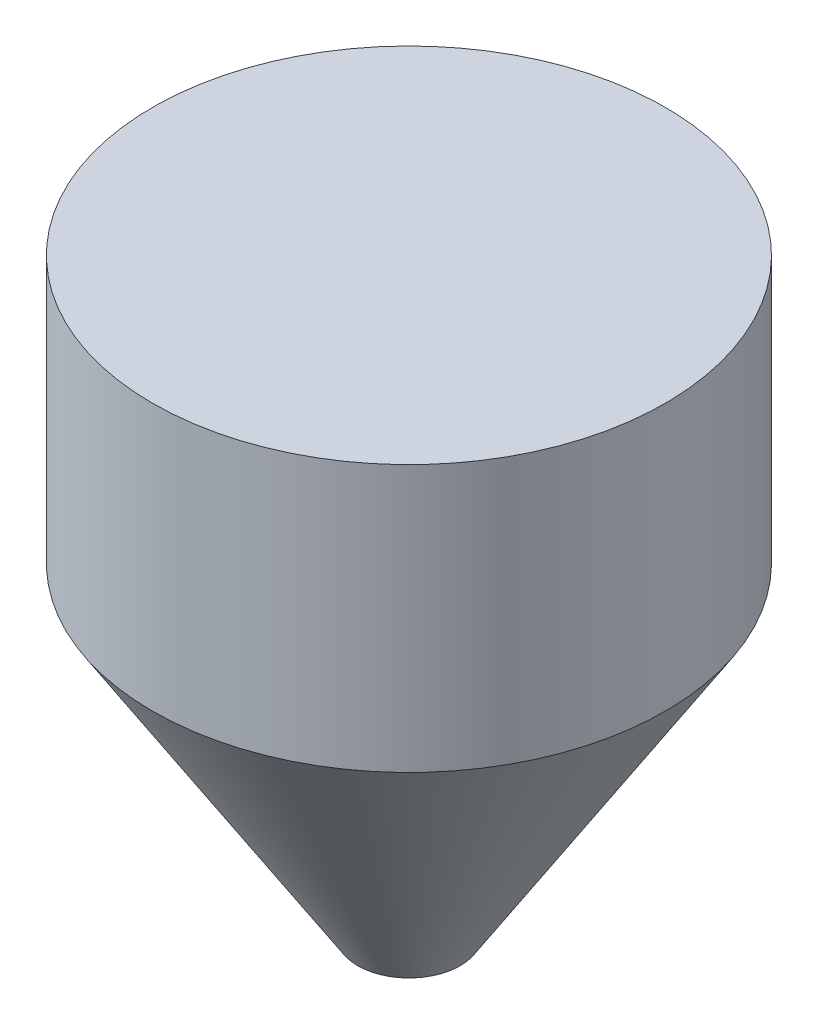
ISO-10303-21;
HEADER;
FILE_DESCRIPTION(('STEP AP214'),'2;1');
FILE_NAME('part.step','',(''),(''),'','','');
FILE_SCHEMA(('AUTOMOTIVE_DESIGN { 1 0 10303 214 1 1 1 1 }'));
ENDSEC;
DATA;
#1=APPLICATION_CONTEXT('core data for automotive mechanical design processes');
#2=APPLICATION_PROTOCOL_DEFINITION('international standard','automotive_design',2000,#1);
#3=PRODUCT_CONTEXT('',#1,'mechanical');
#4=PRODUCT('Part','Part','',(#3));
#5=PRODUCT_RELATED_PRODUCT_CATEGORY('part','',(#4));
#6=PRODUCT_DEFINITION_FORMATION('','',#4);
#7=PRODUCT_DEFINITION_CONTEXT('part definition',#1,'design');
#8=PRODUCT_DEFINITION('design','',#6,#7);
#9=PRODUCT_DEFINITION_SHAPE('','',#8);
#10=(LENGTH_UNIT() NAMED_UNIT(*) SI_UNIT(.MILLI.,.METRE.));
#11=(NAMED_UNIT(*) PLANE_ANGLE_UNIT() SI_UNIT($,.RADIAN.));
#12=(NAMED_UNIT(*) SI_UNIT($,.STERADIAN.) SOLID_ANGLE_UNIT());
#13=UNCERTAINTY_MEASURE_WITH_UNIT(LENGTH_MEASURE(1.E-05),#10,'distance_accuracy_value','');
#14=(GEOMETRIC_REPRESENTATION_CONTEXT(3) GLOBAL_UNCERTAINTY_ASSIGNED_CONTEXT((#13)) GLOBAL_UNIT_ASSIGNED_CONTEXT((#10,
#11,#12)) REPRESENTATION_CONTEXT('',''));
#15=CARTESIAN_POINT('',(0.,0.,0.));
#16=DIRECTION('',(0.,0.,1.));
#17=DIRECTION('',(1.,0.,0.));
#18=AXIS2_PLACEMENT_3D('',#15,#16,#17);
#19=CARTESIAN_POINT('',(0.,-104.,0.));
#20=DIRECTION('',(0.,1.,0.));
#21=DIRECTION('',(0.,0.,1.));
#22=AXIS2_PLACEMENT_3D('',#19,#20,#21);
#23=CYLINDRICAL_SURFACE('',#22,100.);
#24=CARTESIAN_POINT('',(0.,-104.,0.));
#25=DIRECTION('',(0.,-1.,0.));
#26=DIRECTION('',(0.,0.,-1.));
#27=AXIS2_PLACEMENT_3D('',#24,#25,#26);
#28=CIRCLE('',#27,100.);
#29=CARTESIAN_POINT('',(0.,-104.,100.));
#30=VERTEX_POINT('',#29);
#31=EDGE_CURVE('E40',#30,#30,#28,.T.);
#32=CARTESIAN_POINT('',(0.,0.,0.));
#33=DIRECTION('',(0.,1.,0.));
#34=DIRECTION('',(0.,0.,1.));
#35=AXIS2_PLACEMENT_3D('',#32,#33,#34);
#36=CIRCLE('',#35,100.);
#37=CARTESIAN_POINT('',(0.,0.,100.));
#38=VERTEX_POINT('',#37);
#39=EDGE_CURVE('E11',#38,#38,#36,.T.);
#40=CARTESIAN_POINT('',(0.,-104.,100.));
#41=CARTESIAN_POINT('',(0.,-102.916666666667,100.));
#42=CARTESIAN_POINT('',(0.,-101.833333333333,100.));
#43=CARTESIAN_POINT('',(0.,-99.6666666666667,100.));
#44=CARTESIAN_POINT('',(0.,-98.5833333333333,100.));
#45=CARTESIAN_POINT('',(0.,-96.4166666666667,100.));
#46=CARTESIAN_POINT('',(0.,-95.3333333333333,100.));
#47=CARTESIAN_POINT('',(0.,-93.1666666666666,100.));
#48=CARTESIAN_POINT('',(0.,-92.0833333333333,100.));
#49=CARTESIAN_POINT('',(0.,-89.9166666666667,100.));
#50=CARTESIAN_POINT('',(0.,-88.8333333333333,100.));
#51=CARTESIAN_POINT('',(0.,-86.6666666666667,100.));
#52=CARTESIAN_POINT('',(0.,-85.5833333333333,100.));
#53=CARTESIAN_POINT('',(0.,-83.4166666666667,100.));
#54=CARTESIAN_POINT('',(0.,-82.3333333333333,100.));
#55=CARTESIAN_POINT('',(0.,-80.1666666666666,100.));
#56=CARTESIAN_POINT('',(0.,-79.0833333333333,100.));
#57=CARTESIAN_POINT('',(0.,-76.9166666666666,100.));
#58=CARTESIAN_POINT('',(0.,-75.8333333333333,100.));
#59=CARTESIAN_POINT('',(0.,-73.6666666666667,100.));
#60=CARTESIAN_POINT('',(0.,-72.5833333333333,100.));
#61=CARTESIAN_POINT('',(0.,-70.4166666666667,100.));
#62=CARTESIAN_POINT('',(0.,-69.3333333333333,100.));
#63=CARTESIAN_POINT('',(0.,-67.1666666666667,100.));
#64=CARTESIAN_POINT('',(0.,-66.0833333333333,100.));
#65=CARTESIAN_POINT('',(0.,-63.9166666666667,100.));
#66=CARTESIAN_POINT('',(0.,-62.8333333333333,100.));
#67=CARTESIAN_POINT('',(0.,-60.6666666666667,100.));
#68=CARTESIAN_POINT('',(0.,-59.5833333333333,100.));
#69=CARTESIAN_POINT('',(0.,-57.4166666666667,100.));
#70=CARTESIAN_POINT('',(0.,-56.3333333333333,100.));
#71=CARTESIAN_POINT('',(0.,-54.1666666666667,100.));
#72=CARTESIAN_POINT('',(0.,-53.0833333333333,100.));
#73=CARTESIAN_POINT('',(0.,-50.9166666666667,100.));
#74=CARTESIAN_POINT('',(0.,-49.8333333333333,100.));
#75=CARTESIAN_POINT('',(0.,-47.6666666666667,100.));
#76=CARTESIAN_POINT('',(0.,-46.5833333333333,100.));
#77=CARTESIAN_POINT('',(0.,-44.4166666666667,100.));
#78=CARTESIAN_POINT('',(0.,-43.3333333333333,100.));
#79=CARTESIAN_POINT('',(0.,-41.1666666666667,100.));
#80=CARTESIAN_POINT('',(0.,-40.0833333333333,100.));
#81=CARTESIAN_POINT('',(0.,-37.9166666666667,100.));
#82=CARTESIAN_POINT('',(0.,-36.8333333333333,100.));
#83=CARTESIAN_POINT('',(0.,-34.6666666666667,100.));
#84=CARTESIAN_POINT('',(0.,-33.5833333333333,100.));
#85=CARTESIAN_POINT('',(0.,-31.4166666666667,100.));
#86=CARTESIAN_POINT('',(0.,-30.3333333333333,100.));
#87=CARTESIAN_POINT('',(0.,-28.1666666666667,100.));
#88=CARTESIAN_POINT('',(0.,-27.0833333333333,100.));
#89=CARTESIAN_POINT('',(0.,-24.9166666666667,100.));
#90=CARTESIAN_POINT('',(0.,-23.8333333333333,100.));
#91=CARTESIAN_POINT('',(0.,-21.6666666666667,100.));
#92=CARTESIAN_POINT('',(0.,-20.5833333333333,100.));
#93=CARTESIAN_POINT('',(0.,-18.4166666666667,100.));
#94=CARTESIAN_POINT('',(0.,-17.3333333333333,100.));
#95=CARTESIAN_POINT('',(0.,-15.1666666666667,100.));
#96=CARTESIAN_POINT('',(0.,-14.0833333333333,100.));
#97=CARTESIAN_POINT('',(0.,-11.9166666666667,100.));
#98=CARTESIAN_POINT('',(0.,-10.8333333333333,100.));
#99=CARTESIAN_POINT('',(0.,-8.66666666666666,100.));
#100=CARTESIAN_POINT('',(0.,-7.58333333333333,100.));
#101=CARTESIAN_POINT('',(0.,-5.41666666666667,100.));
#102=CARTESIAN_POINT('',(0.,-4.33333333333334,100.));
#103=CARTESIAN_POINT('',(0.,-2.16666666666667,100.));
#104=CARTESIAN_POINT('',(0.,-1.08333333333333,100.));
#105=CARTESIAN_POINT('',(0.,0.,100.));
#106=B_SPLINE_CURVE_WITH_KNOTS('',3,(#40,#41,#42,#43,#44,#45,#46,#47,#48,#49,#50,#51,#52,#53,
#54,#55,#56,#57,#58,#59,#60,#61,#62,#63,#64,#65,#66,#67,#68,#69,#70,#71,#72,#73,#74,#75,#76,#77,
#78,#79,#80,#81,#82,#83,#84,#85,#86,#87,#88,#89,#90,#91,#92,#93,#94,#95,#96,#97,#98,#99,#100,
#101,#102,#103,#104,#105),.UNSPECIFIED.,.F.,.F.,(4,2,2,2,2,2,2,2,2,2,2,2,2,2,2,2,2,2,2,2,2,2,2,
2,2,2,2,2,2,2,2,2,4),(0.,3.25,6.50000000000001,9.75000000000001,13.,16.25,19.5,22.75,26.,29.25,
32.5,35.75,39.,42.25,45.5,48.75,52.,55.25,58.5,61.75,65.,68.25,71.5,74.75,78.,81.25,84.5,87.75,
91.,94.25,97.5,100.75,104.),.UNSPECIFIED.);
#107=EDGE_CURVE('BSEAM34',#30,#38,#106,.T.);
#108=ORIENTED_EDGE('',*,*,#31,.F.);
#109=ORIENTED_EDGE('',*,*,#39,.F.);
#110=ORIENTED_EDGE('',*,*,#107,.T.);
#111=ORIENTED_EDGE('',*,*,#107,.F.);
#112=EDGE_LOOP('',(#108,#110,#109,#111));
#113=FACE_BOUND('',#112,.T.);
#114=ADVANCED_FACE('F34',(#113),#23,.T.);
#115=CARTESIAN_POINT('',(0.,0.,0.));
#116=DIRECTION('',(0.,1.,0.));
#117=DIRECTION('',(0.,0.,1.));
#118=AXIS2_PLACEMENT_3D('',#115,#116,#117);
#119=PLANE('',#118);
#120=ORIENTED_EDGE('',*,*,#39,.T.);
#121=EDGE_LOOP('',(#120));
#122=FACE_BOUND('',#121,.T.);
#123=ADVANCED_FACE('F68',(#122),#119,.T.);
#124=CARTESIAN_POINT('',(0.,-230.,0.));
#125=DIRECTION('',(0.,1.,0.));
#126=DIRECTION('',(0.,0.,1.));
#127=AXIS2_PLACEMENT_3D('',#124,#125,#126);
#128=PLANE('',#127);
#129=CARTESIAN_POINT('',(0.,-230.,0.));
#130=DIRECTION('',(0.,1.,0.));
#131=DIRECTION('',(0.,0.,1.));
#132=AXIS2_PLACEMENT_3D('',#129,#130,#131);
#133=CIRCLE('',#132,20.);
#134=CARTESIAN_POINT('',(0.,-230.,20.));
#135=VERTEX_POINT('',#134);
#136=EDGE_CURVE('E44',#135,#135,#133,.T.);
#137=ORIENTED_EDGE('',*,*,#136,.F.);
#138=EDGE_LOOP('',(#137));
#139=FACE_BOUND('',#138,.T.);
#140=ADVANCED_FACE('F58',(#139),#128,.F.);
#141=CARTESIAN_POINT('',(0.,-230.,0.));
#142=DIRECTION('',(0.,1.,0.));
#143=DIRECTION('',(0.,0.,1.));
#144=AXIS2_PLACEMENT_3D('',#141,#142,#143);
#145=CONICAL_SURFACE('',#144,20.,0.565701468656178);
#146=CARTESIAN_POINT('',(0.,-230.,20.));
#147=CARTESIAN_POINT('',(0.,-228.6875,20.8333333333333));
#148=CARTESIAN_POINT('',(0.,-227.375,21.6666666666667));
#149=CARTESIAN_POINT('',(0.,-224.75,23.3333333333333));
#150=CARTESIAN_POINT('',(0.,-223.4375,24.1666666666667));
#151=CARTESIAN_POINT('',(0.,-220.8125,25.8333333333333));
#152=CARTESIAN_POINT('',(0.,-219.5,26.6666666666667));
#153=CARTESIAN_POINT('',(0.,-216.875,28.3333333333333));
#154=CARTESIAN_POINT('',(0.,-215.5625,29.1666666666667));
#155=CARTESIAN_POINT('',(0.,-212.9375,30.8333333333333));
#156=CARTESIAN_POINT('',(0.,-211.625,31.6666666666667));
#157=CARTESIAN_POINT('',(0.,-209.,33.3333333333333));
#158=CARTESIAN_POINT('',(0.,-207.6875,34.1666666666667));
#159=CARTESIAN_POINT('',(0.,-205.0625,35.8333333333333));
#160=CARTESIAN_POINT('',(0.,-203.75,36.6666666666667));
#161=CARTESIAN_POINT('',(0.,-201.125,38.3333333333333));
#162=CARTESIAN_POINT('',(0.,-199.8125,39.1666666666667));
#163=CARTESIAN_POINT('',(0.,-197.1875,40.8333333333333));
#164=CARTESIAN_POINT('',(0.,-195.875,41.6666666666667));
#165=CARTESIAN_POINT('',(0.,-193.25,43.3333333333333));
#166=CARTESIAN_POINT('',(0.,-191.9375,44.1666666666667));
#167=CARTESIAN_POINT('',(0.,-189.3125,45.8333333333333));
#168=CARTESIAN_POINT('',(0.,-188.,46.6666666666667));
#169=CARTESIAN_POINT('',(0.,-185.375,48.3333333333333));
#170=CARTESIAN_POINT('',(0.,-184.0625,49.1666666666667));
#171=CARTESIAN_POINT('',(0.,-181.4375,50.8333333333333));
#172=CARTESIAN_POINT('',(0.,-180.125,51.6666666666667));
#173=CARTESIAN_POINT('',(0.,-177.5,53.3333333333333));
#174=CARTESIAN_POINT('',(0.,-176.1875,54.1666666666667));
#175=CARTESIAN_POINT('',(0.,-173.5625,55.8333333333333));
#176=CARTESIAN_POINT('',(0.,-172.25,56.6666666666667));
#177=CARTESIAN_POINT('',(0.,-169.625,58.3333333333333));
#178=CARTESIAN_POINT('',(0.,-168.3125,59.1666666666667));
#179=CARTESIAN_POINT('',(0.,-165.6875,60.8333333333333));
#180=CARTESIAN_POINT('',(0.,-164.375,61.6666666666667));
#181=CARTESIAN_POINT('',(0.,-161.75,63.3333333333333));
#182=CARTESIAN_POINT('',(0.,-160.4375,64.1666666666667));
#183=CARTESIAN_POINT('',(0.,-157.8125,65.8333333333334));
#184=CARTESIAN_POINT('',(0.,-156.5,66.6666666666667));
#185=CARTESIAN_POINT('',(0.,-153.875,68.3333333333333));
#186=CARTESIAN_POINT('',(0.,-152.5625,69.1666666666667));
#187=CARTESIAN_POINT('',(0.,-149.9375,70.8333333333333));
#188=CARTESIAN_POINT('',(0.,-148.625,71.6666666666667));
#189=CARTESIAN_POINT('',(0.,-146.,73.3333333333333));
#190=CARTESIAN_POINT('',(0.,-144.6875,74.1666666666667));
#191=CARTESIAN_POINT('',(0.,-142.0625,75.8333333333333));
#192=CARTESIAN_POINT('',(0.,-140.75,76.6666666666667));
#193=CARTESIAN_POINT('',(0.,-138.125,78.3333333333334));
#194=CARTESIAN_POINT('',(0.,-136.8125,79.1666666666667));
#195=CARTESIAN_POINT('',(0.,-134.1875,80.8333333333334));
#196=CARTESIAN_POINT('',(0.,-132.875,81.6666666666667));
#197=CARTESIAN_POINT('',(0.,-130.25,83.3333333333334));
#198=CARTESIAN_POINT('',(0.,-128.9375,84.1666666666667));
#199=CARTESIAN_POINT('',(0.,-126.3125,85.8333333333333));
#200=CARTESIAN_POINT('',(0.,-125.,86.6666666666667));
#201=CARTESIAN_POINT('',(0.,-122.375,88.3333333333333));
#202=CARTESIAN_POINT('',(0.,-121.0625,89.1666666666667));
#203=CARTESIAN_POINT('',(0.,-118.4375,90.8333333333333));
#204=CARTESIAN_POINT('',(0.,-117.125,91.6666666666667));
#205=CARTESIAN_POINT('',(0.,-114.5,93.3333333333333));
#206=CARTESIAN_POINT('',(0.,-113.1875,94.1666666666667));
#207=CARTESIAN_POINT('',(0.,-110.5625,95.8333333333334));
#208=CARTESIAN_POINT('',(0.,-109.25,96.6666666666667));
#209=CARTESIAN_POINT('',(0.,-106.625,98.3333333333334));
#210=CARTESIAN_POINT('',(0.,-105.3125,99.1666666666667));
#211=CARTESIAN_POINT('',(0.,-104.,100.));
#212=B_SPLINE_CURVE_WITH_KNOTS('',3,(#146,#147,#148,#149,#150,#151,#152,#153,#154,#155,#156,
#157,#158,#159,#160,#161,#162,#163,#164,#165,#166,#167,#168,#169,#170,#171,#172,#173,#174,#175,
#176,#177,#178,#179,#180,#181,#182,#183,#184,#185,#186,#187,#188,#189,#190,#191,#192,#193,#194,
#195,#196,#197,#198,#199,#200,#201,#202,#203,#204,#205,#206,#207,#208,#209,#210,#211),
.UNSPECIFIED.,.F.,.F.,(4,2,2,2,2,2,2,2,2,2,2,2,2,2,2,2,2,2,2,2,2,2,2,2,2,2,2,2,2,2,2,2,4),(0.,
4.66410830170142,9.32821660340284,13.9923249051042,18.6564332068056,23.3205415085071,
27.9846498102085,32.6487581119099,37.3128664136113,41.9769747153127,46.6410830170141,
51.3051913187155,55.9692996204169,60.6334079221183,65.2975162238198,69.9616245255212,
74.6257328272226,79.289841128924,83.9539494306254,88.6180577323268,93.2821660340282,
97.9462743357296,102.610382637431,107.274490939132,111.938599240834,116.602707542535,
121.266815844237,125.930924145938,130.595032447639,135.259140749341,139.923249051042,
144.587357352744,149.251465654445),.UNSPECIFIED.);
#213=EDGE_CURVE('BSEAM67',#135,#30,#212,.T.);
#214=ORIENTED_EDGE('',*,*,#136,.T.);
#215=ORIENTED_EDGE('',*,*,#31,.T.);
#216=ORIENTED_EDGE('',*,*,#213,.T.);
#217=ORIENTED_EDGE('',*,*,#213,.F.);
#218=EDGE_LOOP('',(#214,#216,#215,#217));
#219=FACE_BOUND('',#218,.T.);
#220=ADVANCED_FACE('F67',(#219),#145,.T.);
#221=CLOSED_SHELL('',(#114,#123,#140,#220));
#222=MANIFOLD_SOLID_BREP('B2',#221);
#223=ADVANCED_BREP_SHAPE_REPRESENTATION('',(#18,#222),#14);
#224=SHAPE_DEFINITION_REPRESENTATION(#9,#223);
ENDSEC;
END-ISO-10303-21;
